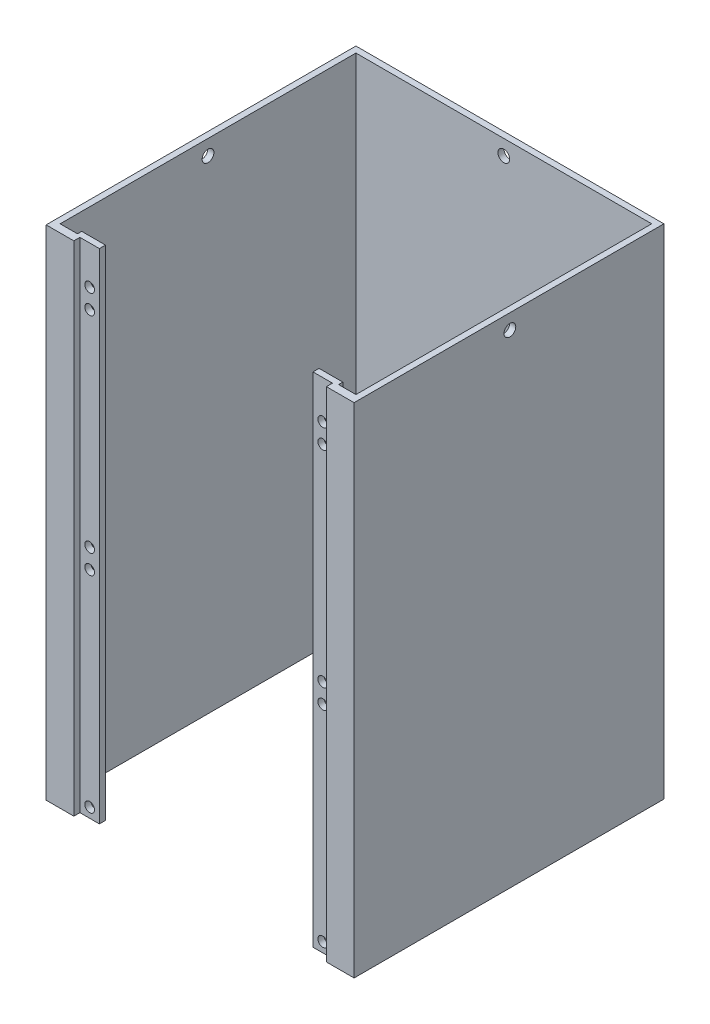
ISO-10303-21;
HEADER;
FILE_DESCRIPTION(('STEP AP214'),'2;1');
FILE_NAME('part.step','',(''),(''),'','','');
FILE_SCHEMA(('AUTOMOTIVE_DESIGN { 1 0 10303 214 1 1 1 1 }'));
ENDSEC;
DATA;
#1=APPLICATION_CONTEXT('core data for automotive mechanical design processes');
#2=APPLICATION_PROTOCOL_DEFINITION('international standard','automotive_design',2000,#1);
#3=PRODUCT_CONTEXT('',#1,'mechanical');
#4=PRODUCT('Part','Part','',(#3));
#5=PRODUCT_RELATED_PRODUCT_CATEGORY('part','',(#4));
#6=PRODUCT_DEFINITION_FORMATION('','',#4);
#7=PRODUCT_DEFINITION_CONTEXT('part definition',#1,'design');
#8=PRODUCT_DEFINITION('design','',#6,#7);
#9=PRODUCT_DEFINITION_SHAPE('','',#8);
#10=(LENGTH_UNIT() NAMED_UNIT(*) SI_UNIT(.MILLI.,.METRE.));
#11=(NAMED_UNIT(*) PLANE_ANGLE_UNIT() SI_UNIT($,.RADIAN.));
#12=(NAMED_UNIT(*) SI_UNIT($,.STERADIAN.) SOLID_ANGLE_UNIT());
#13=UNCERTAINTY_MEASURE_WITH_UNIT(LENGTH_MEASURE(1.E-05),#10,'distance_accuracy_value','');
#14=(GEOMETRIC_REPRESENTATION_CONTEXT(3) GLOBAL_UNCERTAINTY_ASSIGNED_CONTEXT((#13)) GLOBAL_UNIT_ASSIGNED_CONTEXT((#10,
#11,#12)) REPRESENTATION_CONTEXT('',''));
#15=CARTESIAN_POINT('',(0.,0.,0.));
#16=DIRECTION('',(0.,0.,1.));
#17=DIRECTION('',(1.,0.,0.));
#18=AXIS2_PLACEMENT_3D('',#15,#16,#17);
#19=CARTESIAN_POINT('',(9.706,327.5,0.603000000000007));
#20=DIRECTION('',(0.,0.,-1.));
#21=DIRECTION('',(-1.,0.,0.));
#22=AXIS2_PLACEMENT_3D('',#19,#20,#21);
#23=PLANE('',#22);
#24=DIRECTION('',(0.,-1.,0.));
#25=VECTOR('',#24,1.);
#26=CARTESIAN_POINT('',(0.,327.5,0.603000000000009));
#27=LINE('',#26,#25);
#28=CARTESIAN_POINT('',(0.,327.5,0.603000000000009));
#29=VERTEX_POINT('',#28);
#30=CARTESIAN_POINT('',(0.,163.75,0.60300000000001));
#31=VERTEX_POINT('',#30);
#32=EDGE_CURVE('E206',#29,#31,#27,.T.);
#33=ORIENTED_EDGE('',*,*,#32,.T.);
#34=DIRECTION('',(1.,0.,0.));
#35=VECTOR('',#34,1.);
#36=CARTESIAN_POINT('',(9.706,163.75,0.603000000000007));
#37=LINE('',#36,#35);
#38=CARTESIAN_POINT('',(9.10300000000001,163.75,0.603000000000006));
#39=VERTEX_POINT('',#38);
#40=EDGE_CURVE('E188',#31,#39,#37,.T.);
#41=ORIENTED_EDGE('',*,*,#40,.T.);
#42=DIRECTION('',(0.,1.,0.));
#43=VECTOR('',#42,1.);
#44=CARTESIAN_POINT('',(9.10300000000001,124.5,0.603000000000006));
#45=LINE('',#44,#43);
#46=CARTESIAN_POINT('',(9.10300000000001,327.5,0.603000000000006));
#47=VERTEX_POINT('',#46);
#48=EDGE_CURVE('E341',#39,#47,#45,.T.);
#49=ORIENTED_EDGE('',*,*,#48,.T.);
#50=DIRECTION('',(1.,0.,0.));
#51=VECTOR('',#50,1.);
#52=CARTESIAN_POINT('',(9.706,327.5,0.603000000000007));
#53=LINE('',#52,#51);
#54=EDGE_CURVE('E350',#29,#47,#53,.T.);
#55=ORIENTED_EDGE('',*,*,#54,.F.);
#56=EDGE_LOOP('',(#33,#41,#49,#55));
#57=FACE_BOUND('',#56,.T.);
#58=ADVANCED_FACE('F35',(#57),#23,.F.);
#59=CARTESIAN_POINT('',(15.503,327.5,-1.39699999999999));
#60=DIRECTION('',(0.,0.,-1.));
#61=DIRECTION('',(-1.,0.,0.));
#62=AXIS2_PLACEMENT_3D('',#59,#60,#61);
#63=PLANE('',#62);
#64=CARTESIAN_POINT('',(12.303,166.95,-1.39699999999999));
#65=DIRECTION('',(0.,0.,1.));
#66=DIRECTION('',(1.,0.,0.));
#67=AXIS2_PLACEMENT_3D('',#64,#65,#66);
#68=CIRCLE('',#67,1.59999999999999);
#69=CARTESIAN_POINT('',(13.903,166.95,-1.39699999999999));
#70=VERTEX_POINT('',#69);
#71=EDGE_CURVE('E291',#70,#70,#68,.T.);
#72=ORIENTED_EDGE('',*,*,#71,.F.);
#73=EDGE_LOOP('',(#72));
#74=FACE_BOUND('',#73,.T.);
#75=CARTESIAN_POINT('',(12.303,234.525,-1.39699999999999));
#76=DIRECTION('',(0.,0.,1.));
#77=DIRECTION('',(1.,0.,0.));
#78=AXIS2_PLACEMENT_3D('',#75,#76,#77);
#79=CIRCLE('',#78,1.59999999999999);
#80=CARTESIAN_POINT('',(13.903,234.525,-1.39699999999999));
#81=VERTEX_POINT('',#80);
#82=EDGE_CURVE('E279',#81,#81,#79,.T.);
#83=ORIENTED_EDGE('',*,*,#82,.F.);
#84=EDGE_LOOP('',(#83));
#85=FACE_BOUND('',#84,.T.);
#86=CARTESIAN_POINT('',(12.303,240.925,-1.39699999999999));
#87=DIRECTION('',(0.,0.,1.));
#88=DIRECTION('',(1.,0.,0.));
#89=AXIS2_PLACEMENT_3D('',#86,#87,#88);
#90=CIRCLE('',#89,1.59999999999999);
#91=CARTESIAN_POINT('',(13.903,240.925,-1.39699999999999));
#92=VERTEX_POINT('',#91);
#93=EDGE_CURVE('E275',#92,#92,#90,.T.);
#94=ORIENTED_EDGE('',*,*,#93,.F.);
#95=EDGE_LOOP('',(#94));
#96=FACE_BOUND('',#95,.T.);
#97=CARTESIAN_POINT('',(12.303,308.5,-1.39699999999999));
#98=DIRECTION('',(0.,0.,1.));
#99=DIRECTION('',(1.,0.,0.));
#100=AXIS2_PLACEMENT_3D('',#97,#98,#99);
#101=CIRCLE('',#100,1.59999999999999);
#102=CARTESIAN_POINT('',(13.903,308.5,-1.39699999999999));
#103=VERTEX_POINT('',#102);
#104=EDGE_CURVE('E263',#103,#103,#101,.T.);
#105=ORIENTED_EDGE('',*,*,#104,.F.);
#106=EDGE_LOOP('',(#105));
#107=FACE_BOUND('',#106,.T.);
#108=CARTESIAN_POINT('',(12.303,314.9,-1.39699999999999));
#109=DIRECTION('',(0.,0.,1.));
#110=DIRECTION('',(1.,0.,0.));
#111=AXIS2_PLACEMENT_3D('',#108,#109,#110);
#112=CIRCLE('',#111,1.59999999999999);
#113=CARTESIAN_POINT('',(13.903,314.9,-1.39699999999999));
#114=VERTEX_POINT('',#113);
#115=EDGE_CURVE('E259',#114,#114,#112,.T.);
#116=ORIENTED_EDGE('',*,*,#115,.F.);
#117=EDGE_LOOP('',(#116));
#118=FACE_BOUND('',#117,.T.);
#119=DIRECTION('',(0.,1.,0.));
#120=VECTOR('',#119,1.);
#121=CARTESIAN_POINT('',(9.10300000000001,124.5,-1.39699999999999));
#122=LINE('',#121,#120);
#123=CARTESIAN_POINT('',(9.10300000000001,163.75,-1.39699999999999));
#124=VERTEX_POINT('',#123);
#125=CARTESIAN_POINT('',(9.10300000000001,327.5,-1.39699999999999));
#126=VERTEX_POINT('',#125);
#127=EDGE_CURVE('E342',#124,#126,#122,.T.);
#128=ORIENTED_EDGE('',*,*,#127,.F.);
#129=DIRECTION('',(1.,0.,0.));
#130=VECTOR('',#129,1.);
#131=CARTESIAN_POINT('',(15.503,163.75,-1.39699999999999));
#132=LINE('',#131,#130);
#133=CARTESIAN_POINT('',(15.503,163.75,-1.39699999999999));
#134=VERTEX_POINT('',#133);
#135=EDGE_CURVE('E49',#124,#134,#132,.T.);
#136=ORIENTED_EDGE('',*,*,#135,.T.);
#137=DIRECTION('',(0.,-1.,0.));
#138=VECTOR('',#137,1.);
#139=CARTESIAN_POINT('',(15.503,327.5,-1.39699999999999));
#140=LINE('',#139,#138);
#141=CARTESIAN_POINT('',(15.503,327.5,-1.39699999999999));
#142=VERTEX_POINT('',#141);
#143=EDGE_CURVE('E251',#142,#134,#140,.T.);
#144=ORIENTED_EDGE('',*,*,#143,.F.);
#145=DIRECTION('',(1.,0.,0.));
#146=VECTOR('',#145,1.);
#147=CARTESIAN_POINT('',(15.503,327.5,-1.39699999999999));
#148=LINE('',#147,#146);
#149=EDGE_CURVE('E353',#126,#142,#148,.T.);
#150=ORIENTED_EDGE('',*,*,#149,.F.);
#151=EDGE_LOOP('',(#128,#136,#144,#150));
#152=FACE_BOUND('',#151,.T.);
#153=ADVANCED_FACE('F401',(#74,#85,#96,#107,#118,#152),#63,.F.);
#154=CARTESIAN_POINT('',(15.503,327.5,-3.39699999999999));
#155=DIRECTION('',(-1.,0.,0.));
#156=DIRECTION('',(0.,0.,1.));
#157=AXIS2_PLACEMENT_3D('',#154,#155,#156);
#158=PLANE('',#157);
#159=ORIENTED_EDGE('',*,*,#143,.T.);
#160=DIRECTION('',(0.,0.,-1.));
#161=VECTOR('',#160,1.);
#162=CARTESIAN_POINT('',(15.503,163.75,-3.39699999999999));
#163=LINE('',#162,#161);
#164=CARTESIAN_POINT('',(15.503,163.75,-3.39699999999999));
#165=VERTEX_POINT('',#164);
#166=EDGE_CURVE('E406',#134,#165,#163,.T.);
#167=ORIENTED_EDGE('',*,*,#166,.T.);
#168=DIRECTION('',(0.,-1.,0.));
#169=VECTOR('',#168,1.);
#170=CARTESIAN_POINT('',(15.503,327.5,-3.39699999999999));
#171=LINE('',#170,#169);
#172=CARTESIAN_POINT('',(15.503,327.5,-3.39699999999999));
#173=VERTEX_POINT('',#172);
#174=EDGE_CURVE('E248',#173,#165,#171,.T.);
#175=ORIENTED_EDGE('',*,*,#174,.F.);
#176=DIRECTION('',(0.,0.,-1.));
#177=VECTOR('',#176,1.);
#178=CARTESIAN_POINT('',(15.503,327.5,-3.39699999999999));
#179=LINE('',#178,#177);
#180=EDGE_CURVE('E355',#142,#173,#179,.T.);
#181=ORIENTED_EDGE('',*,*,#180,.F.);
#182=EDGE_LOOP('',(#159,#167,#175,#181));
#183=FACE_BOUND('',#182,.T.);
#184=ADVANCED_FACE('F404',(#183),#158,.F.);
#185=CARTESIAN_POINT('',(7.706,327.5,-3.39699999999999));
#186=DIRECTION('',(0.,0.,1.));
#187=DIRECTION('',(1.,0.,0.));
#188=AXIS2_PLACEMENT_3D('',#185,#186,#187);
#189=PLANE('',#188);
#190=CARTESIAN_POINT('',(12.303,166.95,-3.39699999999999));
#191=DIRECTION('',(0.,0.,1.));
#192=DIRECTION('',(1.,0.,0.));
#193=AXIS2_PLACEMENT_3D('',#190,#191,#192);
#194=CIRCLE('',#193,1.59999999999999);
#195=CARTESIAN_POINT('',(13.903,166.95,-3.39699999999999));
#196=VERTEX_POINT('',#195);
#197=EDGE_CURVE('E288',#196,#196,#194,.T.);
#198=ORIENTED_EDGE('',*,*,#197,.T.);
#199=EDGE_LOOP('',(#198));
#200=FACE_BOUND('',#199,.T.);
#201=CARTESIAN_POINT('',(12.303,234.525,-3.39699999999999));
#202=DIRECTION('',(0.,0.,1.));
#203=DIRECTION('',(1.,0.,0.));
#204=AXIS2_PLACEMENT_3D('',#201,#202,#203);
#205=CIRCLE('',#204,1.59999999999999);
#206=CARTESIAN_POINT('',(13.903,234.525,-3.39699999999999));
#207=VERTEX_POINT('',#206);
#208=EDGE_CURVE('E276',#207,#207,#205,.T.);
#209=ORIENTED_EDGE('',*,*,#208,.T.);
#210=EDGE_LOOP('',(#209));
#211=FACE_BOUND('',#210,.T.);
#212=CARTESIAN_POINT('',(12.303,240.925,-3.39699999999999));
#213=DIRECTION('',(0.,0.,1.));
#214=DIRECTION('',(1.,0.,0.));
#215=AXIS2_PLACEMENT_3D('',#212,#213,#214);
#216=CIRCLE('',#215,1.59999999999999);
#217=CARTESIAN_POINT('',(13.903,240.925,-3.39699999999999));
#218=VERTEX_POINT('',#217);
#219=EDGE_CURVE('E272',#218,#218,#216,.T.);
#220=ORIENTED_EDGE('',*,*,#219,.T.);
#221=EDGE_LOOP('',(#220));
#222=FACE_BOUND('',#221,.T.);
#223=CARTESIAN_POINT('',(12.303,308.5,-3.39699999999999));
#224=DIRECTION('',(0.,0.,1.));
#225=DIRECTION('',(1.,0.,0.));
#226=AXIS2_PLACEMENT_3D('',#223,#224,#225);
#227=CIRCLE('',#226,1.59999999999999);
#228=CARTESIAN_POINT('',(13.903,308.5,-3.39699999999999));
#229=VERTEX_POINT('',#228);
#230=EDGE_CURVE('E260',#229,#229,#227,.T.);
#231=ORIENTED_EDGE('',*,*,#230,.T.);
#232=EDGE_LOOP('',(#231));
#233=FACE_BOUND('',#232,.T.);
#234=CARTESIAN_POINT('',(12.303,314.9,-3.39699999999999));
#235=DIRECTION('',(0.,0.,1.));
#236=DIRECTION('',(1.,0.,0.));
#237=AXIS2_PLACEMENT_3D('',#234,#235,#236);
#238=CIRCLE('',#237,1.59999999999999);
#239=CARTESIAN_POINT('',(13.903,314.9,-3.39699999999999));
#240=VERTEX_POINT('',#239);
#241=EDGE_CURVE('E255',#240,#240,#238,.T.);
#242=ORIENTED_EDGE('',*,*,#241,.T.);
#243=EDGE_LOOP('',(#242));
#244=FACE_BOUND('',#243,.T.);
#245=ORIENTED_EDGE('',*,*,#174,.T.);
#246=DIRECTION('',(-1.,0.,0.));
#247=VECTOR('',#246,1.);
#248=CARTESIAN_POINT('',(7.706,163.75,-3.39699999999999));
#249=LINE('',#248,#247);
#250=CARTESIAN_POINT('',(7.706,163.75,-3.39699999999999));
#251=VERTEX_POINT('',#250);
#252=EDGE_CURVE('E511',#165,#251,#249,.T.);
#253=ORIENTED_EDGE('',*,*,#252,.T.);
#254=DIRECTION('',(0.,-1.,0.));
#255=VECTOR('',#254,1.);
#256=CARTESIAN_POINT('',(7.706,327.5,-3.39699999999999));
#257=LINE('',#256,#255);
#258=CARTESIAN_POINT('',(7.706,327.5,-3.39699999999999));
#259=VERTEX_POINT('',#258);
#260=EDGE_CURVE('E245',#259,#251,#257,.T.);
#261=ORIENTED_EDGE('',*,*,#260,.F.);
#262=DIRECTION('',(-1.,0.,0.));
#263=VECTOR('',#262,1.);
#264=CARTESIAN_POINT('',(7.706,327.5,-3.39699999999999));
#265=LINE('',#264,#263);
#266=EDGE_CURVE('E357',#173,#259,#265,.T.);
#267=ORIENTED_EDGE('',*,*,#266,.F.);
#268=EDGE_LOOP('',(#245,#253,#261,#267));
#269=FACE_BOUND('',#268,.T.);
#270=ADVANCED_FACE('F410',(#200,#211,#222,#233,#244,#269),#189,.F.);
#271=CARTESIAN_POINT('',(7.706,327.5,-2.));
#272=DIRECTION('',(1.,0.,0.));
#273=DIRECTION('',(0.,0.,-1.));
#274=AXIS2_PLACEMENT_3D('',#271,#272,#273);
#275=PLANE('',#274);
#276=ORIENTED_EDGE('',*,*,#260,.T.);
#277=DIRECTION('',(0.,0.,1.));
#278=VECTOR('',#277,1.);
#279=CARTESIAN_POINT('',(7.706,163.75,-2.));
#280=LINE('',#279,#278);
#281=CARTESIAN_POINT('',(7.706,163.75,-2.));
#282=VERTEX_POINT('',#281);
#283=EDGE_CURVE('E418',#251,#282,#280,.T.);
#284=ORIENTED_EDGE('',*,*,#283,.T.);
#285=DIRECTION('',(0.,-1.,0.));
#286=VECTOR('',#285,1.);
#287=CARTESIAN_POINT('',(7.706,327.5,-2.));
#288=LINE('',#287,#286);
#289=CARTESIAN_POINT('',(7.706,327.5,-2.));
#290=VERTEX_POINT('',#289);
#291=EDGE_CURVE('E242',#290,#282,#288,.T.);
#292=ORIENTED_EDGE('',*,*,#291,.F.);
#293=DIRECTION('',(0.,0.,1.));
#294=VECTOR('',#293,1.);
#295=CARTESIAN_POINT('',(7.706,327.5,-2.));
#296=LINE('',#295,#294);
#297=EDGE_CURVE('E359',#259,#290,#296,.T.);
#298=ORIENTED_EDGE('',*,*,#297,.F.);
#299=EDGE_LOOP('',(#276,#284,#292,#298));
#300=FACE_BOUND('',#299,.T.);
#301=ADVANCED_FACE('F417',(#300),#275,.F.);
#302=CARTESIAN_POINT('',(2.00000000000001,327.5,-2.));
#303=DIRECTION('',(0.,0.,1.));
#304=DIRECTION('',(1.,0.,0.));
#305=AXIS2_PLACEMENT_3D('',#302,#303,#304);
#306=PLANE('',#305);
#307=ORIENTED_EDGE('',*,*,#291,.T.);
#308=DIRECTION('',(-1.,0.,0.));
#309=VECTOR('',#308,1.);
#310=CARTESIAN_POINT('',(2.00000000000001,163.75,-2.));
#311=LINE('',#310,#309);
#312=CARTESIAN_POINT('',(2.00000000000001,163.75,-2.));
#313=VERTEX_POINT('',#312);
#314=EDGE_CURVE('E423',#282,#313,#311,.T.);
#315=ORIENTED_EDGE('',*,*,#314,.T.);
#316=DIRECTION('',(0.,-1.,0.));
#317=VECTOR('',#316,1.);
#318=CARTESIAN_POINT('',(2.00000000000001,327.5,-2.));
#319=LINE('',#318,#317);
#320=CARTESIAN_POINT('',(2.00000000000001,327.5,-2.));
#321=VERTEX_POINT('',#320);
#322=EDGE_CURVE('E239',#321,#313,#319,.T.);
#323=ORIENTED_EDGE('',*,*,#322,.F.);
#324=DIRECTION('',(-1.,0.,0.));
#325=VECTOR('',#324,1.);
#326=CARTESIAN_POINT('',(2.00000000000001,327.5,-2.));
#327=LINE('',#326,#325);
#328=EDGE_CURVE('E361',#290,#321,#327,.T.);
#329=ORIENTED_EDGE('',*,*,#328,.F.);
#330=EDGE_LOOP('',(#307,#315,#323,#329));
#331=FACE_BOUND('',#330,.T.);
#332=ADVANCED_FACE('F421',(#331),#306,.F.);
#333=CARTESIAN_POINT('',(2.,327.5,-99.206));
#334=DIRECTION('',(-1.,0.,0.));
#335=DIRECTION('',(0.,0.,1.));
#336=AXIS2_PLACEMENT_3D('',#333,#334,#335);
#337=PLANE('',#336);
#338=CARTESIAN_POINT('',(2.00000000000001,322.524,-50.603));
#339=DIRECTION('',(-1.,0.,0.));
#340=DIRECTION('',(0.,0.,1.));
#341=AXIS2_PLACEMENT_3D('',#338,#339,#340);
#342=CIRCLE('',#341,1.93);
#343=CARTESIAN_POINT('',(2.00000000000001,322.524,-48.673));
#344=VERTEX_POINT('',#343);
#345=EDGE_CURVE('E295',#344,#344,#342,.T.);
#346=ORIENTED_EDGE('',*,*,#345,.T.);
#347=EDGE_LOOP('',(#346));
#348=FACE_BOUND('',#347,.T.);
#349=ORIENTED_EDGE('',*,*,#322,.T.);
#350=DIRECTION('',(0.,0.,-1.));
#351=VECTOR('',#350,1.);
#352=CARTESIAN_POINT('',(2.,163.75,-99.206));
#353=LINE('',#352,#351);
#354=CARTESIAN_POINT('',(2.,163.75,-99.206));
#355=VERTEX_POINT('',#354);
#356=EDGE_CURVE('E507',#313,#355,#353,.T.);
#357=ORIENTED_EDGE('',*,*,#356,.T.);
#358=DIRECTION('',(0.,-1.,0.));
#359=VECTOR('',#358,1.);
#360=CARTESIAN_POINT('',(2.,327.5,-99.206));
#361=LINE('',#360,#359);
#362=CARTESIAN_POINT('',(2.,327.5,-99.206));
#363=VERTEX_POINT('',#362);
#364=EDGE_CURVE('E236',#363,#355,#361,.T.);
#365=ORIENTED_EDGE('',*,*,#364,.F.);
#366=DIRECTION('',(0.,0.,-1.));
#367=VECTOR('',#366,1.);
#368=CARTESIAN_POINT('',(2.,327.5,-99.206));
#369=LINE('',#368,#367);
#370=EDGE_CURVE('E363',#321,#363,#369,.T.);
#371=ORIENTED_EDGE('',*,*,#370,.F.);
#372=EDGE_LOOP('',(#349,#357,#365,#371));
#373=FACE_BOUND('',#372,.T.);
#374=ADVANCED_FACE('F427',(#348,#373),#337,.F.);
#375=CARTESIAN_POINT('',(99.206,327.5,-99.206));
#376=DIRECTION('',(0.,0.,-1.));
#377=DIRECTION('',(-1.,0.,0.));
#378=AXIS2_PLACEMENT_3D('',#375,#376,#377);
#379=PLANE('',#378);
#380=CARTESIAN_POINT('',(50.603,322.524,-99.206));
#381=DIRECTION('',(0.,0.,-1.));
#382=DIRECTION('',(-1.,0.,0.));
#383=AXIS2_PLACEMENT_3D('',#380,#381,#382);
#384=CIRCLE('',#383,1.93);
#385=CARTESIAN_POINT('',(48.673,322.524,-99.206));
#386=VERTEX_POINT('',#385);
#387=EDGE_CURVE('E305',#386,#386,#384,.T.);
#388=ORIENTED_EDGE('',*,*,#387,.T.);
#389=EDGE_LOOP('',(#388));
#390=FACE_BOUND('',#389,.T.);
#391=ORIENTED_EDGE('',*,*,#364,.T.);
#392=DIRECTION('',(1.,0.,0.));
#393=VECTOR('',#392,1.);
#394=CARTESIAN_POINT('',(99.206,163.75,-99.206));
#395=LINE('',#394,#393);
#396=CARTESIAN_POINT('',(99.206,163.75,-99.206));
#397=VERTEX_POINT('',#396);
#398=EDGE_CURVE('E435',#355,#397,#395,.T.);
#399=ORIENTED_EDGE('',*,*,#398,.T.);
#400=DIRECTION('',(0.,-1.,0.));
#401=VECTOR('',#400,1.);
#402=CARTESIAN_POINT('',(99.206,327.5,-99.206));
#403=LINE('',#402,#401);
#404=CARTESIAN_POINT('',(99.206,327.5,-99.206));
#405=VERTEX_POINT('',#404);
#406=EDGE_CURVE('E233',#405,#397,#403,.T.);
#407=ORIENTED_EDGE('',*,*,#406,.F.);
#408=DIRECTION('',(1.,0.,0.));
#409=VECTOR('',#408,1.);
#410=CARTESIAN_POINT('',(99.206,327.5,-99.206));
#411=LINE('',#410,#409);
#412=EDGE_CURVE('E365',#363,#405,#411,.T.);
#413=ORIENTED_EDGE('',*,*,#412,.F.);
#414=EDGE_LOOP('',(#391,#399,#407,#413));
#415=FACE_BOUND('',#414,.T.);
#416=ADVANCED_FACE('F434',(#390,#415),#379,.F.);
#417=CARTESIAN_POINT('',(99.206,327.5,-2.));
#418=DIRECTION('',(1.,0.,0.));
#419=DIRECTION('',(0.,0.,-1.));
#420=AXIS2_PLACEMENT_3D('',#417,#418,#419);
#421=PLANE('',#420);
#422=CARTESIAN_POINT('',(99.206,322.524,-50.603));
#423=DIRECTION('',(1.,0.,0.));
#424=DIRECTION('',(0.,0.,-1.));
#425=AXIS2_PLACEMENT_3D('',#422,#423,#424);
#426=CIRCLE('',#425,1.93);
#427=CARTESIAN_POINT('',(99.206,322.524,-52.533));
#428=VERTEX_POINT('',#427);
#429=EDGE_CURVE('E298',#428,#428,#426,.T.);
#430=ORIENTED_EDGE('',*,*,#429,.T.);
#431=EDGE_LOOP('',(#430));
#432=FACE_BOUND('',#431,.T.);
#433=ORIENTED_EDGE('',*,*,#406,.T.);
#434=DIRECTION('',(0.,0.,1.));
#435=VECTOR('',#434,1.);
#436=CARTESIAN_POINT('',(99.206,163.75,-2.));
#437=LINE('',#436,#435);
#438=CARTESIAN_POINT('',(99.206,163.75,-2.));
#439=VERTEX_POINT('',#438);
#440=EDGE_CURVE('E440',#397,#439,#437,.T.);
#441=ORIENTED_EDGE('',*,*,#440,.T.);
#442=DIRECTION('',(0.,-1.,0.));
#443=VECTOR('',#442,1.);
#444=CARTESIAN_POINT('',(99.206,327.5,-2.));
#445=LINE('',#444,#443);
#446=CARTESIAN_POINT('',(99.206,327.5,-2.));
#447=VERTEX_POINT('',#446);
#448=EDGE_CURVE('E230',#447,#439,#445,.T.);
#449=ORIENTED_EDGE('',*,*,#448,.F.);
#450=DIRECTION('',(0.,0.,1.));
#451=VECTOR('',#450,1.);
#452=CARTESIAN_POINT('',(99.206,327.5,-2.));
#453=LINE('',#452,#451);
#454=EDGE_CURVE('E367',#405,#447,#453,.T.);
#455=ORIENTED_EDGE('',*,*,#454,.F.);
#456=EDGE_LOOP('',(#433,#441,#449,#455));
#457=FACE_BOUND('',#456,.T.);
#458=ADVANCED_FACE('F438',(#432,#457),#421,.F.);
#459=CARTESIAN_POINT('',(93.5,327.5,-2.));
#460=DIRECTION('',(0.,0.,1.));
#461=DIRECTION('',(1.,0.,0.));
#462=AXIS2_PLACEMENT_3D('',#459,#460,#461);
#463=PLANE('',#462);
#464=ORIENTED_EDGE('',*,*,#448,.T.);
#465=DIRECTION('',(-1.,0.,0.));
#466=VECTOR('',#465,1.);
#467=CARTESIAN_POINT('',(93.5,163.75,-2.));
#468=LINE('',#467,#466);
#469=CARTESIAN_POINT('',(93.5,163.75,-2.));
#470=VERTEX_POINT('',#469);
#471=EDGE_CURVE('E503',#439,#470,#468,.T.);
#472=ORIENTED_EDGE('',*,*,#471,.T.);
#473=DIRECTION('',(0.,-1.,0.));
#474=VECTOR('',#473,1.);
#475=CARTESIAN_POINT('',(93.5,327.5,-2.));
#476=LINE('',#475,#474);
#477=CARTESIAN_POINT('',(93.5,327.5,-2.));
#478=VERTEX_POINT('',#477);
#479=EDGE_CURVE('E227',#478,#470,#476,.T.);
#480=ORIENTED_EDGE('',*,*,#479,.F.);
#481=DIRECTION('',(-1.,0.,0.));
#482=VECTOR('',#481,1.);
#483=CARTESIAN_POINT('',(93.5,327.5,-2.));
#484=LINE('',#483,#482);
#485=EDGE_CURVE('E369',#447,#478,#484,.T.);
#486=ORIENTED_EDGE('',*,*,#485,.F.);
#487=EDGE_LOOP('',(#464,#472,#480,#486));
#488=FACE_BOUND('',#487,.T.);
#489=ADVANCED_FACE('F444',(#488),#463,.F.);
#490=CARTESIAN_POINT('',(93.5,327.5,-3.4));
#491=DIRECTION('',(-1.,0.,0.));
#492=DIRECTION('',(0.,0.,1.));
#493=AXIS2_PLACEMENT_3D('',#490,#491,#492);
#494=PLANE('',#493);
#495=ORIENTED_EDGE('',*,*,#479,.T.);
#496=DIRECTION('',(0.,0.,-1.));
#497=VECTOR('',#496,1.);
#498=CARTESIAN_POINT('',(93.5,163.75,-3.4));
#499=LINE('',#498,#497);
#500=CARTESIAN_POINT('',(93.5,163.75,-3.4));
#501=VERTEX_POINT('',#500);
#502=EDGE_CURVE('E452',#470,#501,#499,.T.);
#503=ORIENTED_EDGE('',*,*,#502,.T.);
#504=DIRECTION('',(0.,-1.,0.));
#505=VECTOR('',#504,1.);
#506=CARTESIAN_POINT('',(93.5,327.5,-3.4));
#507=LINE('',#506,#505);
#508=CARTESIAN_POINT('',(93.5,327.5,-3.4));
#509=VERTEX_POINT('',#508);
#510=EDGE_CURVE('E224',#509,#501,#507,.T.);
#511=ORIENTED_EDGE('',*,*,#510,.F.);
#512=DIRECTION('',(0.,0.,-1.));
#513=VECTOR('',#512,1.);
#514=CARTESIAN_POINT('',(93.5,327.5,-3.4));
#515=LINE('',#514,#513);
#516=EDGE_CURVE('E371',#478,#509,#515,.T.);
#517=ORIENTED_EDGE('',*,*,#516,.F.);
#518=EDGE_LOOP('',(#495,#503,#511,#517));
#519=FACE_BOUND('',#518,.T.);
#520=ADVANCED_FACE('F451',(#519),#494,.F.);
#521=CARTESIAN_POINT('',(85.703,327.5,-3.4));
#522=DIRECTION('',(0.,0.,1.));
#523=DIRECTION('',(1.,0.,0.));
#524=AXIS2_PLACEMENT_3D('',#521,#522,#523);
#525=PLANE('',#524);
#526=CARTESIAN_POINT('',(88.903,166.95,-3.4));
#527=DIRECTION('',(0.,0.,1.));
#528=DIRECTION('',(1.,0.,0.));
#529=AXIS2_PLACEMENT_3D('',#526,#527,#528);
#530=CIRCLE('',#529,1.59999999999999);
#531=CARTESIAN_POINT('',(90.503,166.95,-3.4));
#532=VERTEX_POINT('',#531);
#533=EDGE_CURVE('E294',#532,#532,#530,.T.);
#534=ORIENTED_EDGE('',*,*,#533,.T.);
#535=EDGE_LOOP('',(#534));
#536=FACE_BOUND('',#535,.T.);
#537=CARTESIAN_POINT('',(88.903,234.525,-3.4));
#538=DIRECTION('',(0.,0.,1.));
#539=DIRECTION('',(1.,0.,0.));
#540=AXIS2_PLACEMENT_3D('',#537,#538,#539);
#541=CIRCLE('',#540,1.59999999999999);
#542=CARTESIAN_POINT('',(90.503,234.525,-3.4));
#543=VERTEX_POINT('',#542);
#544=EDGE_CURVE('E284',#543,#543,#541,.T.);
#545=ORIENTED_EDGE('',*,*,#544,.T.);
#546=EDGE_LOOP('',(#545));
#547=FACE_BOUND('',#546,.T.);
#548=CARTESIAN_POINT('',(88.903,240.925,-3.4));
#549=DIRECTION('',(0.,0.,1.));
#550=DIRECTION('',(1.,0.,0.));
#551=AXIS2_PLACEMENT_3D('',#548,#549,#550);
#552=CIRCLE('',#551,1.59999999999999);
#553=CARTESIAN_POINT('',(90.503,240.925,-3.4));
#554=VERTEX_POINT('',#553);
#555=EDGE_CURVE('E283',#554,#554,#552,.T.);
#556=ORIENTED_EDGE('',*,*,#555,.T.);
#557=EDGE_LOOP('',(#556));
#558=FACE_BOUND('',#557,.T.);
#559=CARTESIAN_POINT('',(88.903,308.5,-3.4));
#560=DIRECTION('',(0.,0.,1.));
#561=DIRECTION('',(1.,0.,0.));
#562=AXIS2_PLACEMENT_3D('',#559,#560,#561);
#563=CIRCLE('',#562,1.59999999999999);
#564=CARTESIAN_POINT('',(90.503,308.5,-3.4));
#565=VERTEX_POINT('',#564);
#566=EDGE_CURVE('E268',#565,#565,#563,.T.);
#567=ORIENTED_EDGE('',*,*,#566,.T.);
#568=EDGE_LOOP('',(#567));
#569=FACE_BOUND('',#568,.T.);
#570=CARTESIAN_POINT('',(88.903,314.9,-3.4));
#571=DIRECTION('',(0.,0.,1.));
#572=DIRECTION('',(1.,0.,0.));
#573=AXIS2_PLACEMENT_3D('',#570,#571,#572);
#574=CIRCLE('',#573,1.59999999999999);
#575=CARTESIAN_POINT('',(90.503,314.9,-3.4));
#576=VERTEX_POINT('',#575);
#577=EDGE_CURVE('E267',#576,#576,#574,.T.);
#578=ORIENTED_EDGE('',*,*,#577,.T.);
#579=EDGE_LOOP('',(#578));
#580=FACE_BOUND('',#579,.T.);
#581=ORIENTED_EDGE('',*,*,#510,.T.);
#582=DIRECTION('',(-1.,0.,0.));
#583=VECTOR('',#582,1.);
#584=CARTESIAN_POINT('',(85.703,163.75,-3.4));
#585=LINE('',#584,#583);
#586=CARTESIAN_POINT('',(85.703,163.75,-3.4));
#587=VERTEX_POINT('',#586);
#588=EDGE_CURVE('E457',#501,#587,#585,.T.);
#589=ORIENTED_EDGE('',*,*,#588,.T.);
#590=DIRECTION('',(0.,-1.,0.));
#591=VECTOR('',#590,1.);
#592=CARTESIAN_POINT('',(85.703,327.5,-3.4));
#593=LINE('',#592,#591);
#594=CARTESIAN_POINT('',(85.703,327.5,-3.4));
#595=VERTEX_POINT('',#594);
#596=EDGE_CURVE('E221',#595,#587,#593,.T.);
#597=ORIENTED_EDGE('',*,*,#596,.F.);
#598=DIRECTION('',(-1.,0.,0.));
#599=VECTOR('',#598,1.);
#600=CARTESIAN_POINT('',(85.703,327.5,-3.4));
#601=LINE('',#600,#599);
#602=EDGE_CURVE('E373',#509,#595,#601,.T.);
#603=ORIENTED_EDGE('',*,*,#602,.F.);
#604=EDGE_LOOP('',(#581,#589,#597,#603));
#605=FACE_BOUND('',#604,.T.);
#606=ADVANCED_FACE('F455',(#536,#547,#558,#569,#580,#605),#525,.F.);
#607=CARTESIAN_POINT('',(85.703,327.5,-1.4));
#608=DIRECTION('',(1.,0.,0.));
#609=DIRECTION('',(0.,0.,-1.));
#610=AXIS2_PLACEMENT_3D('',#607,#608,#609);
#611=PLANE('',#610);
#612=ORIENTED_EDGE('',*,*,#596,.T.);
#613=DIRECTION('',(0.,0.,1.));
#614=VECTOR('',#613,1.);
#615=CARTESIAN_POINT('',(85.703,163.75,-1.4));
#616=LINE('',#615,#614);
#617=CARTESIAN_POINT('',(85.703,163.75,-1.4));
#618=VERTEX_POINT('',#617);
#619=EDGE_CURVE('E499',#587,#618,#616,.T.);
#620=ORIENTED_EDGE('',*,*,#619,.T.);
#621=DIRECTION('',(0.,-1.,0.));
#622=VECTOR('',#621,1.);
#623=CARTESIAN_POINT('',(85.703,327.5,-1.4));
#624=LINE('',#623,#622);
#625=CARTESIAN_POINT('',(85.703,327.5,-1.4));
#626=VERTEX_POINT('',#625);
#627=EDGE_CURVE('E218',#626,#618,#624,.T.);
#628=ORIENTED_EDGE('',*,*,#627,.F.);
#629=DIRECTION('',(0.,0.,1.));
#630=VECTOR('',#629,1.);
#631=CARTESIAN_POINT('',(85.703,327.5,-1.4));
#632=LINE('',#631,#630);
#633=EDGE_CURVE('E375',#595,#626,#632,.T.);
#634=ORIENTED_EDGE('',*,*,#633,.F.);
#635=EDGE_LOOP('',(#612,#620,#628,#634));
#636=FACE_BOUND('',#635,.T.);
#637=ADVANCED_FACE('F461',(#636),#611,.F.);
#638=CARTESIAN_POINT('',(91.5,327.5,-1.4));
#639=DIRECTION('',(0.,0.,-1.));
#640=DIRECTION('',(-1.,0.,0.));
#641=AXIS2_PLACEMENT_3D('',#638,#639,#640);
#642=PLANE('',#641);
#643=CARTESIAN_POINT('',(88.903,166.95,-1.4));
#644=DIRECTION('',(0.,0.,-1.));
#645=DIRECTION('',(-1.,0.,0.));
#646=AXIS2_PLACEMENT_3D('',#643,#644,#645);
#647=CIRCLE('',#646,1.59999999999999);
#648=CARTESIAN_POINT('',(87.303,166.95,-1.4));
#649=VERTEX_POINT('',#648);
#650=EDGE_CURVE('E292',#649,#649,#647,.T.);
#651=ORIENTED_EDGE('',*,*,#650,.T.);
#652=EDGE_LOOP('',(#651));
#653=FACE_BOUND('',#652,.T.);
#654=CARTESIAN_POINT('',(88.903,234.525,-1.4));
#655=DIRECTION('',(0.,0.,-1.));
#656=DIRECTION('',(-1.,0.,0.));
#657=AXIS2_PLACEMENT_3D('',#654,#655,#656);
#658=CIRCLE('',#657,1.59999999999999);
#659=CARTESIAN_POINT('',(87.303,234.525,-1.4));
#660=VERTEX_POINT('',#659);
#661=EDGE_CURVE('E285',#660,#660,#658,.T.);
#662=ORIENTED_EDGE('',*,*,#661,.T.);
#663=EDGE_LOOP('',(#662));
#664=FACE_BOUND('',#663,.T.);
#665=CARTESIAN_POINT('',(88.903,240.925,-1.4));
#666=DIRECTION('',(0.,0.,-1.));
#667=DIRECTION('',(-1.,0.,0.));
#668=AXIS2_PLACEMENT_3D('',#665,#666,#667);
#669=CIRCLE('',#668,1.59999999999999);
#670=CARTESIAN_POINT('',(87.303,240.925,-1.4));
#671=VERTEX_POINT('',#670);
#672=EDGE_CURVE('E280',#671,#671,#669,.T.);
#673=ORIENTED_EDGE('',*,*,#672,.T.);
#674=EDGE_LOOP('',(#673));
#675=FACE_BOUND('',#674,.T.);
#676=CARTESIAN_POINT('',(88.903,308.5,-1.4));
#677=DIRECTION('',(0.,0.,-1.));
#678=DIRECTION('',(-1.,0.,0.));
#679=AXIS2_PLACEMENT_3D('',#676,#677,#678);
#680=CIRCLE('',#679,1.59999999999999);
#681=CARTESIAN_POINT('',(87.303,308.5,-1.4));
#682=VERTEX_POINT('',#681);
#683=EDGE_CURVE('E269',#682,#682,#680,.T.);
#684=ORIENTED_EDGE('',*,*,#683,.T.);
#685=EDGE_LOOP('',(#684));
#686=FACE_BOUND('',#685,.T.);
#687=CARTESIAN_POINT('',(88.903,314.9,-1.4));
#688=DIRECTION('',(0.,0.,-1.));
#689=DIRECTION('',(-1.,0.,0.));
#690=AXIS2_PLACEMENT_3D('',#687,#688,#689);
#691=CIRCLE('',#690,1.59999999999999);
#692=CARTESIAN_POINT('',(87.303,314.9,-1.4));
#693=VERTEX_POINT('',#692);
#694=EDGE_CURVE('E264',#693,#693,#691,.T.);
#695=ORIENTED_EDGE('',*,*,#694,.T.);
#696=EDGE_LOOP('',(#695));
#697=FACE_BOUND('',#696,.T.);
#698=ORIENTED_EDGE('',*,*,#627,.T.);
#699=DIRECTION('',(1.,0.,0.));
#700=VECTOR('',#699,1.);
#701=CARTESIAN_POINT('',(91.5,163.75,-1.4));
#702=LINE('',#701,#700);
#703=CARTESIAN_POINT('',(91.5,163.75,-1.4));
#704=VERTEX_POINT('',#703);
#705=EDGE_CURVE('E469',#618,#704,#702,.T.);
#706=ORIENTED_EDGE('',*,*,#705,.T.);
#707=DIRECTION('',(0.,-1.,0.));
#708=VECTOR('',#707,1.);
#709=CARTESIAN_POINT('',(91.5,327.5,-1.4));
#710=LINE('',#709,#708);
#711=CARTESIAN_POINT('',(91.5,327.5,-1.4));
#712=VERTEX_POINT('',#711);
#713=EDGE_CURVE('E215',#712,#704,#710,.T.);
#714=ORIENTED_EDGE('',*,*,#713,.F.);
#715=DIRECTION('',(1.,0.,0.));
#716=VECTOR('',#715,1.);
#717=CARTESIAN_POINT('',(91.5,327.5,-1.4));
#718=LINE('',#717,#716);
#719=EDGE_CURVE('E377',#626,#712,#718,.T.);
#720=ORIENTED_EDGE('',*,*,#719,.F.);
#721=EDGE_LOOP('',(#698,#706,#714,#720));
#722=FACE_BOUND('',#721,.T.);
#723=ADVANCED_FACE('F468',(#653,#664,#675,#686,#697,#722),#642,.F.);
#724=CARTESIAN_POINT('',(91.5,327.5,0.599999999999998));
#725=DIRECTION('',(1.,0.,0.));
#726=DIRECTION('',(0.,0.,-1.));
#727=AXIS2_PLACEMENT_3D('',#724,#725,#726);
#728=PLANE('',#727);
#729=ORIENTED_EDGE('',*,*,#713,.T.);
#730=DIRECTION('',(0.,0.,1.));
#731=VECTOR('',#730,1.);
#732=CARTESIAN_POINT('',(91.5,163.75,0.599999999999998));
#733=LINE('',#732,#731);
#734=CARTESIAN_POINT('',(91.5,163.75,-1.39699999999999));
#735=VERTEX_POINT('',#734);
#736=EDGE_CURVE('E474',#704,#735,#733,.T.);
#737=ORIENTED_EDGE('',*,*,#736,.T.);
#738=DIRECTION('',(0.,1.,0.));
#739=VECTOR('',#738,1.);
#740=CARTESIAN_POINT('',(91.5,327.5,-1.39699999999999));
#741=LINE('',#740,#739);
#742=CARTESIAN_POINT('',(91.5,327.5,-1.39699999999999));
#743=VERTEX_POINT('',#742);
#744=EDGE_CURVE('E348',#735,#743,#741,.T.);
#745=ORIENTED_EDGE('',*,*,#744,.T.);
#746=DIRECTION('',(0.,0.,1.));
#747=VECTOR('',#746,1.);
#748=CARTESIAN_POINT('',(91.5,327.5,0.599999999999998));
#749=LINE('',#748,#747);
#750=EDGE_CURVE('E379',#712,#743,#749,.T.);
#751=ORIENTED_EDGE('',*,*,#750,.F.);
#752=EDGE_LOOP('',(#729,#737,#745,#751));
#753=FACE_BOUND('',#752,.T.);
#754=ADVANCED_FACE('F472',(#753),#728,.F.);
#755=CARTESIAN_POINT('',(101.206,327.5,0.599999999999998));
#756=DIRECTION('',(0.,0.,-1.));
#757=DIRECTION('',(-1.,0.,0.));
#758=AXIS2_PLACEMENT_3D('',#755,#756,#757);
#759=PLANE('',#758);
#760=DIRECTION('',(0.,-1.,0.));
#761=VECTOR('',#760,1.);
#762=CARTESIAN_POINT('',(92.103,327.5,0.599999999999998));
#763=LINE('',#762,#761);
#764=CARTESIAN_POINT('',(92.103,327.5,0.599999999999998));
#765=VERTEX_POINT('',#764);
#766=CARTESIAN_POINT('',(92.103,163.75,0.599999999999998));
#767=VERTEX_POINT('',#766);
#768=EDGE_CURVE('E56',#765,#767,#763,.T.);
#769=ORIENTED_EDGE('',*,*,#768,.T.);
#770=DIRECTION('',(1.,0.,0.));
#771=VECTOR('',#770,1.);
#772=CARTESIAN_POINT('',(101.206,163.75,0.599999999999998));
#773=LINE('',#772,#771);
#774=CARTESIAN_POINT('',(101.206,163.75,0.599999999999998));
#775=VERTEX_POINT('',#774);
#776=EDGE_CURVE('E485',#767,#775,#773,.T.);
#777=ORIENTED_EDGE('',*,*,#776,.T.);
#778=DIRECTION('',(0.,-1.,0.));
#779=VECTOR('',#778,1.);
#780=CARTESIAN_POINT('',(101.206,327.5,0.599999999999998));
#781=LINE('',#780,#779);
#782=CARTESIAN_POINT('',(101.206,327.5,0.599999999999998));
#783=VERTEX_POINT('',#782);
#784=EDGE_CURVE('E208',#783,#775,#781,.T.);
#785=ORIENTED_EDGE('',*,*,#784,.F.);
#786=DIRECTION('',(1.,0.,0.));
#787=VECTOR('',#786,1.);
#788=CARTESIAN_POINT('',(101.206,327.5,0.599999999999998));
#789=LINE('',#788,#787);
#790=EDGE_CURVE('E382',#765,#783,#789,.T.);
#791=ORIENTED_EDGE('',*,*,#790,.F.);
#792=EDGE_LOOP('',(#769,#777,#785,#791));
#793=FACE_BOUND('',#792,.T.);
#794=ADVANCED_FACE('F482',(#793),#759,.F.);
#795=CARTESIAN_POINT('',(101.206,327.5,-101.206));
#796=DIRECTION('',(-1.,0.,0.));
#797=DIRECTION('',(0.,0.,1.));
#798=AXIS2_PLACEMENT_3D('',#795,#796,#797);
#799=PLANE('',#798);
#800=CARTESIAN_POINT('',(101.206,322.524,-50.603));
#801=DIRECTION('',(1.,0.,0.));
#802=DIRECTION('',(0.,0.,-1.));
#803=AXIS2_PLACEMENT_3D('',#800,#801,#802);
#804=CIRCLE('',#803,1.93);
#805=CARTESIAN_POINT('',(101.206,322.524,-52.533));
#806=VERTEX_POINT('',#805);
#807=EDGE_CURVE('E299',#806,#806,#804,.T.);
#808=ORIENTED_EDGE('',*,*,#807,.F.);
#809=EDGE_LOOP('',(#808));
#810=FACE_BOUND('',#809,.T.);
#811=ORIENTED_EDGE('',*,*,#784,.T.);
#812=DIRECTION('',(0.,0.,-1.));
#813=VECTOR('',#812,1.);
#814=CARTESIAN_POINT('',(101.206,163.75,-101.206));
#815=LINE('',#814,#813);
#816=CARTESIAN_POINT('',(101.206,163.75,-101.206));
#817=VERTEX_POINT('',#816);
#818=EDGE_CURVE('E488',#775,#817,#815,.T.);
#819=ORIENTED_EDGE('',*,*,#818,.T.);
#820=DIRECTION('',(0.,-1.,0.));
#821=VECTOR('',#820,1.);
#822=CARTESIAN_POINT('',(101.206,327.5,-101.206));
#823=LINE('',#822,#821);
#824=CARTESIAN_POINT('',(101.206,327.5,-101.206));
#825=VERTEX_POINT('',#824);
#826=EDGE_CURVE('E202',#825,#817,#823,.T.);
#827=ORIENTED_EDGE('',*,*,#826,.F.);
#828=DIRECTION('',(0.,0.,-1.));
#829=VECTOR('',#828,1.);
#830=CARTESIAN_POINT('',(101.206,327.5,-101.206));
#831=LINE('',#830,#829);
#832=EDGE_CURVE('E384',#783,#825,#831,.T.);
#833=ORIENTED_EDGE('',*,*,#832,.F.);
#834=EDGE_LOOP('',(#811,#819,#827,#833));
#835=FACE_BOUND('',#834,.T.);
#836=ADVANCED_FACE('F487',(#810,#835),#799,.F.);
#837=CARTESIAN_POINT('',(0.,327.5,-101.206));
#838=DIRECTION('',(0.,0.,1.));
#839=DIRECTION('',(1.,0.,0.));
#840=AXIS2_PLACEMENT_3D('',#837,#838,#839);
#841=PLANE('',#840);
#842=CARTESIAN_POINT('',(50.603,322.524,-101.206));
#843=DIRECTION('',(0.,0.,-1.));
#844=DIRECTION('',(-1.,0.,0.));
#845=AXIS2_PLACEMENT_3D('',#842,#843,#844);
#846=CIRCLE('',#845,1.93);
#847=CARTESIAN_POINT('',(48.673,322.524,-101.206));
#848=VERTEX_POINT('',#847);
#849=EDGE_CURVE('E310',#848,#848,#846,.T.);
#850=ORIENTED_EDGE('',*,*,#849,.F.);
#851=EDGE_LOOP('',(#850));
#852=FACE_BOUND('',#851,.T.);
#853=ORIENTED_EDGE('',*,*,#826,.T.);
#854=DIRECTION('',(-1.,0.,0.));
#855=VECTOR('',#854,1.);
#856=CARTESIAN_POINT('',(231.,163.75,-101.206));
#857=LINE('',#856,#855);
#858=CARTESIAN_POINT('',(0.,163.75,-101.206));
#859=VERTEX_POINT('',#858);
#860=EDGE_CURVE('E185',#817,#859,#857,.T.);
#861=ORIENTED_EDGE('',*,*,#860,.T.);
#862=DIRECTION('',(0.,-1.,0.));
#863=VECTOR('',#862,1.);
#864=CARTESIAN_POINT('',(0.,327.5,-101.206));
#865=LINE('',#864,#863);
#866=CARTESIAN_POINT('',(0.,327.5,-101.206));
#867=VERTEX_POINT('',#866);
#868=EDGE_CURVE('E199',#867,#859,#865,.T.);
#869=ORIENTED_EDGE('',*,*,#868,.F.);
#870=DIRECTION('',(-1.,0.,0.));
#871=VECTOR('',#870,1.);
#872=CARTESIAN_POINT('',(0.,327.5,-101.206));
#873=LINE('',#872,#871);
#874=EDGE_CURVE('E386',#825,#867,#873,.T.);
#875=ORIENTED_EDGE('',*,*,#874,.F.);
#876=EDGE_LOOP('',(#853,#861,#869,#875));
#877=FACE_BOUND('',#876,.T.);
#878=ADVANCED_FACE('F197',(#852,#877),#841,.F.);
#879=CARTESIAN_POINT('',(0.,327.5,0.603000000000009));
#880=DIRECTION('',(1.,0.,0.));
#881=DIRECTION('',(0.,0.,-1.));
#882=AXIS2_PLACEMENT_3D('',#879,#880,#881);
#883=PLANE('',#882);
#884=CARTESIAN_POINT('',(0.,322.524,-50.603));
#885=DIRECTION('',(1.,0.,0.));
#886=DIRECTION('',(0.,0.,-1.));
#887=AXIS2_PLACEMENT_3D('',#884,#885,#886);
#888=CIRCLE('',#887,1.93);
#889=CARTESIAN_POINT('',(0.,322.524,-52.533));
#890=VERTEX_POINT('',#889);
#891=EDGE_CURVE('E296',#890,#890,#888,.T.);
#892=ORIENTED_EDGE('',*,*,#891,.T.);
#893=EDGE_LOOP('',(#892));
#894=FACE_BOUND('',#893,.T.);
#895=ORIENTED_EDGE('',*,*,#868,.T.);
#896=DIRECTION('',(0.,0.,-1.));
#897=VECTOR('',#896,1.);
#898=CARTESIAN_POINT('',(0.,163.75,29.0457092807515));
#899=LINE('',#898,#897);
#900=EDGE_CURVE('E182',#31,#859,#899,.T.);
#901=ORIENTED_EDGE('',*,*,#900,.F.);
#902=ORIENTED_EDGE('',*,*,#32,.F.);
#903=DIRECTION('',(0.,0.,1.));
#904=VECTOR('',#903,1.);
#905=CARTESIAN_POINT('',(0.,327.5,0.603000000000009));
#906=LINE('',#905,#904);
#907=EDGE_CURVE('E205',#867,#29,#906,.T.);
#908=ORIENTED_EDGE('',*,*,#907,.F.);
#909=EDGE_LOOP('',(#895,#901,#902,#908));
#910=FACE_BOUND('',#909,.T.);
#911=ADVANCED_FACE('F204',(#894,#910),#883,.F.);
#912=CARTESIAN_POINT('',(0.,327.5,0.));
#913=DIRECTION('',(0.,-1.,0.));
#914=DIRECTION('',(0.,0.,-1.));
#915=AXIS2_PLACEMENT_3D('',#912,#913,#914);
#916=PLANE('',#915);
#917=ORIENTED_EDGE('',*,*,#54,.T.);
#918=DIRECTION('',(0.,0.,1.));
#919=VECTOR('',#918,1.);
#920=CARTESIAN_POINT('',(9.10300000000001,327.5,0.603000000000006));
#921=LINE('',#920,#919);
#922=EDGE_CURVE('E258',#126,#47,#921,.T.);
#923=ORIENTED_EDGE('',*,*,#922,.F.);
#924=ORIENTED_EDGE('',*,*,#149,.T.);
#925=ORIENTED_EDGE('',*,*,#180,.T.);
#926=ORIENTED_EDGE('',*,*,#266,.T.);
#927=ORIENTED_EDGE('',*,*,#297,.T.);
#928=ORIENTED_EDGE('',*,*,#328,.T.);
#929=ORIENTED_EDGE('',*,*,#370,.T.);
#930=ORIENTED_EDGE('',*,*,#412,.T.);
#931=ORIENTED_EDGE('',*,*,#454,.T.);
#932=ORIENTED_EDGE('',*,*,#485,.T.);
#933=ORIENTED_EDGE('',*,*,#516,.T.);
#934=ORIENTED_EDGE('',*,*,#602,.T.);
#935=ORIENTED_EDGE('',*,*,#633,.T.);
#936=ORIENTED_EDGE('',*,*,#719,.T.);
#937=ORIENTED_EDGE('',*,*,#750,.T.);
#938=DIRECTION('',(-1.,0.,0.));
#939=VECTOR('',#938,1.);
#940=CARTESIAN_POINT('',(9.10300000000001,327.5,-1.39699999999999));
#941=LINE('',#940,#939);
#942=CARTESIAN_POINT('',(92.103,327.5,-1.39699999999999));
#943=VERTEX_POINT('',#942);
#944=EDGE_CURVE('E338',#943,#743,#941,.T.);
#945=ORIENTED_EDGE('',*,*,#944,.F.);
#946=DIRECTION('',(0.,0.,1.));
#947=VECTOR('',#946,1.);
#948=CARTESIAN_POINT('',(92.103,327.5,0.));
#949=LINE('',#948,#947);
#950=EDGE_CURVE('E42',#943,#765,#949,.T.);
#951=ORIENTED_EDGE('',*,*,#950,.T.);
#952=ORIENTED_EDGE('',*,*,#790,.T.);
#953=ORIENTED_EDGE('',*,*,#832,.T.);
#954=ORIENTED_EDGE('',*,*,#874,.T.);
#955=ORIENTED_EDGE('',*,*,#907,.T.);
#956=EDGE_LOOP('',(#917,#923,#924,#925,#926,#927,#928,#929,#930,#931,#932,#933,#934,#935,#936,
#937,#945,#951,#952,#953,#954,#955));
#957=FACE_BOUND('',#956,.T.);
#958=ADVANCED_FACE('F388',(#957),#916,.F.);
#959=CARTESIAN_POINT('',(92.103,124.5,0.603000000000009));
#960=DIRECTION('',(1.,0.,0.));
#961=DIRECTION('',(0.,0.,-1.));
#962=AXIS2_PLACEMENT_3D('',#959,#960,#961);
#963=PLANE('',#962);
#964=DIRECTION('',(0.,1.,0.));
#965=VECTOR('',#964,1.);
#966=CARTESIAN_POINT('',(92.103,124.5,-1.39699999999999));
#967=LINE('',#966,#965);
#968=CARTESIAN_POINT('',(92.103,163.75,-1.39699999999999));
#969=VERTEX_POINT('',#968);
#970=EDGE_CURVE('E344',#969,#943,#967,.T.);
#971=ORIENTED_EDGE('',*,*,#970,.F.);
#972=DIRECTION('',(0.,0.,1.));
#973=VECTOR('',#972,1.);
#974=CARTESIAN_POINT('',(92.103,163.75,0.603000000000009));
#975=LINE('',#974,#973);
#976=EDGE_CURVE('E491',#969,#767,#975,.T.);
#977=ORIENTED_EDGE('',*,*,#976,.T.);
#978=ORIENTED_EDGE('',*,*,#768,.F.);
#979=ORIENTED_EDGE('',*,*,#950,.F.);
#980=EDGE_LOOP('',(#971,#977,#978,#979));
#981=FACE_BOUND('',#980,.T.);
#982=ADVANCED_FACE('F515',(#981),#963,.F.);
#983=CARTESIAN_POINT('',(9.10300000000001,124.5,-1.39699999999999));
#984=DIRECTION('',(0.,0.,-1.));
#985=DIRECTION('',(-1.,0.,0.));
#986=AXIS2_PLACEMENT_3D('',#983,#984,#985);
#987=PLANE('',#986);
#988=ORIENTED_EDGE('',*,*,#744,.F.);
#989=DIRECTION('',(1.,0.,0.));
#990=VECTOR('',#989,1.);
#991=CARTESIAN_POINT('',(9.10300000000001,163.75,-1.39699999999999));
#992=LINE('',#991,#990);
#993=EDGE_CURVE('E495',#735,#969,#992,.T.);
#994=ORIENTED_EDGE('',*,*,#993,.T.);
#995=ORIENTED_EDGE('',*,*,#970,.T.);
#996=ORIENTED_EDGE('',*,*,#944,.T.);
#997=EDGE_LOOP('',(#988,#994,#995,#996));
#998=FACE_BOUND('',#997,.T.);
#999=ADVANCED_FACE('F477',(#998),#987,.F.);
#1000=CARTESIAN_POINT('',(9.10300000000001,124.5,0.603000000000006));
#1001=DIRECTION('',(-1.,0.,0.));
#1002=DIRECTION('',(0.,0.,1.));
#1003=AXIS2_PLACEMENT_3D('',#1000,#1001,#1002);
#1004=PLANE('',#1003);
#1005=ORIENTED_EDGE('',*,*,#48,.F.);
#1006=DIRECTION('',(0.,0.,-1.));
#1007=VECTOR('',#1006,1.);
#1008=CARTESIAN_POINT('',(9.10300000000001,163.75,0.603000000000006));
#1009=LINE('',#1008,#1007);
#1010=EDGE_CURVE('E11',#39,#124,#1009,.T.);
#1011=ORIENTED_EDGE('',*,*,#1010,.T.);
#1012=ORIENTED_EDGE('',*,*,#127,.T.);
#1013=ORIENTED_EDGE('',*,*,#922,.T.);
#1014=EDGE_LOOP('',(#1005,#1011,#1012,#1013));
#1015=FACE_BOUND('',#1014,.T.);
#1016=ADVANCED_FACE('F394',(#1015),#1004,.F.);
#1017=CARTESIAN_POINT('',(12.303,314.9,-11.397));
#1018=DIRECTION('',(0.,0.,1.));
#1019=DIRECTION('',(1.,0.,0.));
#1020=AXIS2_PLACEMENT_3D('',#1017,#1018,#1019);
#1021=CYLINDRICAL_SURFACE('',#1020,1.59999999999999);
#1022=ORIENTED_EDGE('',*,*,#115,.T.);
#1023=EDGE_LOOP('',(#1022));
#1024=FACE_BOUND('',#1023,.T.);
#1025=ORIENTED_EDGE('',*,*,#241,.F.);
#1026=EDGE_LOOP('',(#1025));
#1027=FACE_BOUND('',#1026,.T.);
#1028=ADVANCED_FACE('F577',(#1024,#1027),#1021,.F.);
#1029=CARTESIAN_POINT('',(12.303,308.5,-11.397));
#1030=DIRECTION('',(0.,0.,1.));
#1031=DIRECTION('',(1.,0.,0.));
#1032=AXIS2_PLACEMENT_3D('',#1029,#1030,#1031);
#1033=CYLINDRICAL_SURFACE('',#1032,1.59999999999999);
#1034=ORIENTED_EDGE('',*,*,#104,.T.);
#1035=EDGE_LOOP('',(#1034));
#1036=FACE_BOUND('',#1035,.T.);
#1037=ORIENTED_EDGE('',*,*,#230,.F.);
#1038=EDGE_LOOP('',(#1037));
#1039=FACE_BOUND('',#1038,.T.);
#1040=ADVANCED_FACE('F581',(#1036,#1039),#1033,.F.);
#1041=CARTESIAN_POINT('',(88.903,314.9,-11.397));
#1042=DIRECTION('',(0.,0.,1.));
#1043=DIRECTION('',(1.,0.,0.));
#1044=AXIS2_PLACEMENT_3D('',#1041,#1042,#1043);
#1045=CYLINDRICAL_SURFACE('',#1044,1.59999999999999);
#1046=ORIENTED_EDGE('',*,*,#694,.F.);
#1047=EDGE_LOOP('',(#1046));
#1048=FACE_BOUND('',#1047,.T.);
#1049=ORIENTED_EDGE('',*,*,#577,.F.);
#1050=EDGE_LOOP('',(#1049));
#1051=FACE_BOUND('',#1050,.T.);
#1052=ADVANCED_FACE('F587',(#1048,#1051),#1045,.F.);
#1053=CARTESIAN_POINT('',(88.903,308.5,-11.397));
#1054=DIRECTION('',(0.,0.,1.));
#1055=DIRECTION('',(1.,0.,0.));
#1056=AXIS2_PLACEMENT_3D('',#1053,#1054,#1055);
#1057=CYLINDRICAL_SURFACE('',#1056,1.59999999999999);
#1058=ORIENTED_EDGE('',*,*,#683,.F.);
#1059=EDGE_LOOP('',(#1058));
#1060=FACE_BOUND('',#1059,.T.);
#1061=ORIENTED_EDGE('',*,*,#566,.F.);
#1062=EDGE_LOOP('',(#1061));
#1063=FACE_BOUND('',#1062,.T.);
#1064=ADVANCED_FACE('F594',(#1060,#1063),#1057,.F.);
#1065=CARTESIAN_POINT('',(12.303,240.925,-11.397));
#1066=DIRECTION('',(0.,0.,1.));
#1067=DIRECTION('',(1.,0.,0.));
#1068=AXIS2_PLACEMENT_3D('',#1065,#1066,#1067);
#1069=CYLINDRICAL_SURFACE('',#1068,1.59999999999999);
#1070=ORIENTED_EDGE('',*,*,#93,.T.);
#1071=EDGE_LOOP('',(#1070));
#1072=FACE_BOUND('',#1071,.T.);
#1073=ORIENTED_EDGE('',*,*,#219,.F.);
#1074=EDGE_LOOP('',(#1073));
#1075=FACE_BOUND('',#1074,.T.);
#1076=ADVANCED_FACE('F598',(#1072,#1075),#1069,.F.);
#1077=CARTESIAN_POINT('',(12.303,234.525,-11.397));
#1078=DIRECTION('',(0.,0.,1.));
#1079=DIRECTION('',(1.,0.,0.));
#1080=AXIS2_PLACEMENT_3D('',#1077,#1078,#1079);
#1081=CYLINDRICAL_SURFACE('',#1080,1.59999999999999);
#1082=ORIENTED_EDGE('',*,*,#82,.T.);
#1083=EDGE_LOOP('',(#1082));
#1084=FACE_BOUND('',#1083,.T.);
#1085=ORIENTED_EDGE('',*,*,#208,.F.);
#1086=EDGE_LOOP('',(#1085));
#1087=FACE_BOUND('',#1086,.T.);
#1088=ADVANCED_FACE('F602',(#1084,#1087),#1081,.F.);
#1089=CARTESIAN_POINT('',(88.903,240.925,-11.397));
#1090=DIRECTION('',(0.,0.,1.));
#1091=DIRECTION('',(1.,0.,0.));
#1092=AXIS2_PLACEMENT_3D('',#1089,#1090,#1091);
#1093=CYLINDRICAL_SURFACE('',#1092,1.59999999999999);
#1094=ORIENTED_EDGE('',*,*,#672,.F.);
#1095=EDGE_LOOP('',(#1094));
#1096=FACE_BOUND('',#1095,.T.);
#1097=ORIENTED_EDGE('',*,*,#555,.F.);
#1098=EDGE_LOOP('',(#1097));
#1099=FACE_BOUND('',#1098,.T.);
#1100=ADVANCED_FACE('F606',(#1096,#1099),#1093,.F.);
#1101=CARTESIAN_POINT('',(88.903,234.525,-11.397));
#1102=DIRECTION('',(0.,0.,1.));
#1103=DIRECTION('',(1.,0.,0.));
#1104=AXIS2_PLACEMENT_3D('',#1101,#1102,#1103);
#1105=CYLINDRICAL_SURFACE('',#1104,1.59999999999999);
#1106=ORIENTED_EDGE('',*,*,#661,.F.);
#1107=EDGE_LOOP('',(#1106));
#1108=FACE_BOUND('',#1107,.T.);
#1109=ORIENTED_EDGE('',*,*,#544,.F.);
#1110=EDGE_LOOP('',(#1109));
#1111=FACE_BOUND('',#1110,.T.);
#1112=ADVANCED_FACE('F610',(#1108,#1111),#1105,.F.);
#1113=CARTESIAN_POINT('',(12.303,166.95,-11.397));
#1114=DIRECTION('',(0.,0.,1.));
#1115=DIRECTION('',(1.,0.,0.));
#1116=AXIS2_PLACEMENT_3D('',#1113,#1114,#1115);
#1117=CYLINDRICAL_SURFACE('',#1116,1.59999999999999);
#1118=ORIENTED_EDGE('',*,*,#71,.T.);
#1119=EDGE_LOOP('',(#1118));
#1120=FACE_BOUND('',#1119,.T.);
#1121=ORIENTED_EDGE('',*,*,#197,.F.);
#1122=EDGE_LOOP('',(#1121));
#1123=FACE_BOUND('',#1122,.T.);
#1124=ADVANCED_FACE('F614',(#1120,#1123),#1117,.F.);
#1125=CARTESIAN_POINT('',(88.903,166.95,-11.397));
#1126=DIRECTION('',(0.,0.,1.));
#1127=DIRECTION('',(1.,0.,0.));
#1128=AXIS2_PLACEMENT_3D('',#1125,#1126,#1127);
#1129=CYLINDRICAL_SURFACE('',#1128,1.59999999999999);
#1130=ORIENTED_EDGE('',*,*,#650,.F.);
#1131=EDGE_LOOP('',(#1130));
#1132=FACE_BOUND('',#1131,.T.);
#1133=ORIENTED_EDGE('',*,*,#533,.F.);
#1134=EDGE_LOOP('',(#1133));
#1135=FACE_BOUND('',#1134,.T.);
#1136=ADVANCED_FACE('F618',(#1132,#1135),#1129,.F.);
#1137=CARTESIAN_POINT('',(-0.793999999999975,322.524,-50.603));
#1138=DIRECTION('',(1.,0.,0.));
#1139=DIRECTION('',(0.,0.,-1.));
#1140=AXIS2_PLACEMENT_3D('',#1137,#1138,#1139);
#1141=CYLINDRICAL_SURFACE('',#1140,1.93);
#1142=ORIENTED_EDGE('',*,*,#891,.F.);
#1143=EDGE_LOOP('',(#1142));
#1144=FACE_BOUND('',#1143,.T.);
#1145=ORIENTED_EDGE('',*,*,#345,.F.);
#1146=EDGE_LOOP('',(#1145));
#1147=FACE_BOUND('',#1146,.T.);
#1148=ADVANCED_FACE('F622',(#1144,#1147),#1141,.F.);
#1149=ORIENTED_EDGE('',*,*,#807,.T.);
#1150=EDGE_LOOP('',(#1149));
#1151=FACE_BOUND('',#1150,.T.);
#1152=ORIENTED_EDGE('',*,*,#429,.F.);
#1153=EDGE_LOOP('',(#1152));
#1154=FACE_BOUND('',#1153,.T.);
#1155=ADVANCED_FACE('F626',(#1151,#1154),#1141,.F.);
#1156=CARTESIAN_POINT('',(50.603,322.524,-91.206));
#1157=DIRECTION('',(0.,0.,-1.));
#1158=DIRECTION('',(-1.,0.,0.));
#1159=AXIS2_PLACEMENT_3D('',#1156,#1157,#1158);
#1160=CYLINDRICAL_SURFACE('',#1159,1.93);
#1161=ORIENTED_EDGE('',*,*,#849,.T.);
#1162=EDGE_LOOP('',(#1161));
#1163=FACE_BOUND('',#1162,.T.);
#1164=ORIENTED_EDGE('',*,*,#387,.F.);
#1165=EDGE_LOOP('',(#1164));
#1166=FACE_BOUND('',#1165,.T.);
#1167=ADVANCED_FACE('F628',(#1163,#1166),#1160,.F.);
#1168=CARTESIAN_POINT('',(231.,163.75,29.0457092807515));
#1169=DIRECTION('',(0.,1.,0.));
#1170=DIRECTION('',(0.,0.,1.));
#1171=AXIS2_PLACEMENT_3D('',#1168,#1169,#1170);
#1172=PLANE('',#1171);
#1173=ORIENTED_EDGE('',*,*,#776,.F.);
#1174=ORIENTED_EDGE('',*,*,#976,.F.);
#1175=ORIENTED_EDGE('',*,*,#993,.F.);
#1176=ORIENTED_EDGE('',*,*,#736,.F.);
#1177=ORIENTED_EDGE('',*,*,#705,.F.);
#1178=ORIENTED_EDGE('',*,*,#619,.F.);
#1179=ORIENTED_EDGE('',*,*,#588,.F.);
#1180=ORIENTED_EDGE('',*,*,#502,.F.);
#1181=ORIENTED_EDGE('',*,*,#471,.F.);
#1182=ORIENTED_EDGE('',*,*,#440,.F.);
#1183=ORIENTED_EDGE('',*,*,#398,.F.);
#1184=ORIENTED_EDGE('',*,*,#356,.F.);
#1185=ORIENTED_EDGE('',*,*,#314,.F.);
#1186=ORIENTED_EDGE('',*,*,#283,.F.);
#1187=ORIENTED_EDGE('',*,*,#252,.F.);
#1188=ORIENTED_EDGE('',*,*,#166,.F.);
#1189=ORIENTED_EDGE('',*,*,#135,.F.);
#1190=ORIENTED_EDGE('',*,*,#1010,.F.);
#1191=ORIENTED_EDGE('',*,*,#40,.F.);
#1192=ORIENTED_EDGE('',*,*,#900,.T.);
#1193=ORIENTED_EDGE('',*,*,#860,.F.);
#1194=ORIENTED_EDGE('',*,*,#818,.F.);
#1195=EDGE_LOOP('',(#1173,#1174,#1175,#1176,#1177,#1178,#1179,#1180,#1181,#1182,#1183,#1184,
#1185,#1186,#1187,#1188,#1189,#1190,#1191,#1192,#1193,#1194));
#1196=FACE_BOUND('',#1195,.T.);
#1197=ADVANCED_FACE('F184',(#1196),#1172,.F.);
#1198=CLOSED_SHELL('',(#58,#153,#184,#270,#301,#332,#374,#416,#458,#489,#520,#606,#637,#723,
#754,#794,#836,#878,#911,#958,#982,#999,#1016,#1028,#1040,#1052,#1064,#1076,#1088,#1100,#1112,
#1124,#1136,#1148,#1155,#1167,#1197));
#1199=MANIFOLD_SOLID_BREP('B2',#1198);
#1200=ADVANCED_BREP_SHAPE_REPRESENTATION('',(#18,#1199),#14);
#1201=SHAPE_DEFINITION_REPRESENTATION(#9,#1200);
ENDSEC;
END-ISO-10303-21;
